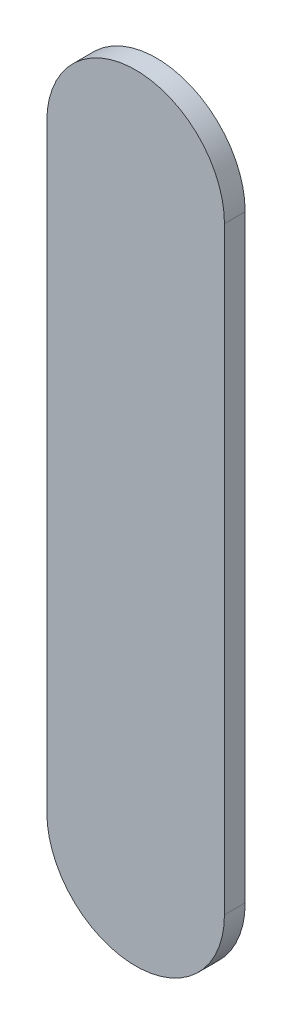
ISO-10303-21;
HEADER;
FILE_DESCRIPTION(('STEP AP214'),'2;1');
FILE_NAME('part.step','',(''),(''),'','','');
FILE_SCHEMA(('AUTOMOTIVE_DESIGN { 1 0 10303 214 1 1 1 1 }'));
ENDSEC;
DATA;
#1=APPLICATION_CONTEXT('core data for automotive mechanical design processes');
#2=APPLICATION_PROTOCOL_DEFINITION('international standard','automotive_design',2000,#1);
#3=PRODUCT_CONTEXT('',#1,'mechanical');
#4=PRODUCT('Part','Part','',(#3));
#5=PRODUCT_RELATED_PRODUCT_CATEGORY('part','',(#4));
#6=PRODUCT_DEFINITION_FORMATION('','',#4);
#7=PRODUCT_DEFINITION_CONTEXT('part definition',#1,'design');
#8=PRODUCT_DEFINITION('design','',#6,#7);
#9=PRODUCT_DEFINITION_SHAPE('','',#8);
#10=(LENGTH_UNIT() NAMED_UNIT(*) SI_UNIT(.MILLI.,.METRE.));
#11=(NAMED_UNIT(*) PLANE_ANGLE_UNIT() SI_UNIT($,.RADIAN.));
#12=(NAMED_UNIT(*) SI_UNIT($,.STERADIAN.) SOLID_ANGLE_UNIT());
#13=UNCERTAINTY_MEASURE_WITH_UNIT(LENGTH_MEASURE(1.E-05),#10,'distance_accuracy_value','');
#14=(GEOMETRIC_REPRESENTATION_CONTEXT(3) GLOBAL_UNCERTAINTY_ASSIGNED_CONTEXT((#13)) GLOBAL_UNIT_ASSIGNED_CONTEXT((#10,
#11,#12)) REPRESENTATION_CONTEXT('',''));
#15=CARTESIAN_POINT('',(0.,0.,0.));
#16=DIRECTION('',(0.,0.,1.));
#17=DIRECTION('',(1.,0.,0.));
#18=AXIS2_PLACEMENT_3D('',#15,#16,#17);
#19=CARTESIAN_POINT('',(132.19,-120.6,1.635));
#20=DIRECTION('',(0.,0.,1.));
#21=DIRECTION('',(1.,0.,0.));
#22=AXIS2_PLACEMENT_3D('',#19,#20,#21);
#23=PLANE('',#22);
#24=DIRECTION('',(0.,1.,0.));
#25=VECTOR('',#24,1.);
#26=CARTESIAN_POINT('',(132.19,-120.6,1.635));
#27=LINE('',#26,#25);
#28=CARTESIAN_POINT('',(132.19,-120.6,1.635));
#29=VERTEX_POINT('',#28);
#30=CARTESIAN_POINT('',(132.19,-119.589045,1.635));
#31=VERTEX_POINT('',#30);
#32=EDGE_CURVE('E70',#29,#31,#27,.T.);
#33=ORIENTED_EDGE('',*,*,#32,.T.);
#34=CARTESIAN_POINT('',(132.04,-119.589045,1.635));
#35=DIRECTION('',(0.,0.,1.));
#36=DIRECTION('',(1.,0.,0.));
#37=AXIS2_PLACEMENT_3D('',#34,#35,#36);
#38=CIRCLE('',#37,0.15);
#39=CARTESIAN_POINT('',(131.89,-119.589045,1.635));
#40=VERTEX_POINT('',#39);
#41=EDGE_CURVE('E68',#31,#40,#38,.T.);
#42=ORIENTED_EDGE('',*,*,#41,.T.);
#43=DIRECTION('',(0.,-1.,0.));
#44=VECTOR('',#43,1.);
#45=CARTESIAN_POINT('',(131.89,-119.589045,1.635));
#46=LINE('',#45,#44);
#47=CARTESIAN_POINT('',(131.89,-120.6,1.635));
#48=VERTEX_POINT('',#47);
#49=EDGE_CURVE('E56',#40,#48,#46,.T.);
#50=ORIENTED_EDGE('',*,*,#49,.T.);
#51=CARTESIAN_POINT('',(132.04,-120.6,1.635));
#52=DIRECTION('',(0.,0.,1.));
#53=DIRECTION('',(-1.,0.,0.));
#54=AXIS2_PLACEMENT_3D('',#51,#52,#53);
#55=CIRCLE('',#54,0.15);
#56=EDGE_CURVE('E11',#48,#29,#55,.T.);
#57=ORIENTED_EDGE('',*,*,#56,.T.);
#58=EDGE_LOOP('',(#33,#42,#50,#57));
#59=FACE_BOUND('',#58,.T.);
#60=ADVANCED_FACE('F17',(#59),#23,.T.);
#61=CARTESIAN_POINT('',(132.19,-120.6,1.6));
#62=DIRECTION('',(0.,0.,1.));
#63=DIRECTION('',(1.,0.,0.));
#64=AXIS2_PLACEMENT_3D('',#61,#62,#63);
#65=PLANE('',#64);
#66=CARTESIAN_POINT('',(132.04,-120.6,1.6));
#67=DIRECTION('',(0.,0.,1.));
#68=DIRECTION('',(-1.,0.,0.));
#69=AXIS2_PLACEMENT_3D('',#66,#67,#68);
#70=CIRCLE('',#69,0.15);
#71=CARTESIAN_POINT('',(131.89,-120.6,1.6));
#72=VERTEX_POINT('',#71);
#73=CARTESIAN_POINT('',(132.19,-120.6,1.6));
#74=VERTEX_POINT('',#73);
#75=EDGE_CURVE('E26',#72,#74,#70,.T.);
#76=ORIENTED_EDGE('',*,*,#75,.F.);
#77=DIRECTION('',(0.,-1.,0.));
#78=VECTOR('',#77,1.);
#79=CARTESIAN_POINT('',(131.89,-119.589045,1.6));
#80=LINE('',#79,#78);
#81=CARTESIAN_POINT('',(131.89,-119.589045,1.6));
#82=VERTEX_POINT('',#81);
#83=EDGE_CURVE('E75',#82,#72,#80,.T.);
#84=ORIENTED_EDGE('',*,*,#83,.F.);
#85=CARTESIAN_POINT('',(132.04,-119.589045,1.6));
#86=DIRECTION('',(0.,0.,1.));
#87=DIRECTION('',(1.,0.,0.));
#88=AXIS2_PLACEMENT_3D('',#85,#86,#87);
#89=CIRCLE('',#88,0.15);
#90=CARTESIAN_POINT('',(132.19,-119.589045,1.6));
#91=VERTEX_POINT('',#90);
#92=EDGE_CURVE('E79',#91,#82,#89,.T.);
#93=ORIENTED_EDGE('',*,*,#92,.F.);
#94=DIRECTION('',(0.,1.,0.));
#95=VECTOR('',#94,1.);
#96=CARTESIAN_POINT('',(132.19,-120.6,1.6));
#97=LINE('',#96,#95);
#98=EDGE_CURVE('E108',#74,#91,#97,.T.);
#99=ORIENTED_EDGE('',*,*,#98,.F.);
#100=EDGE_LOOP('',(#76,#84,#93,#99));
#101=FACE_BOUND('',#100,.T.);
#102=ADVANCED_FACE('F111',(#101),#65,.F.);
#103=CARTESIAN_POINT('',(132.04,-120.6,1.6));
#104=DIRECTION('',(0.,0.,-1.));
#105=DIRECTION('',(-1.,0.,0.));
#106=AXIS2_PLACEMENT_3D('',#103,#104,#105);
#107=CYLINDRICAL_SURFACE('',#106,0.15);
#108=ORIENTED_EDGE('',*,*,#75,.T.);
#109=DIRECTION('',(0.,0.,1.));
#110=VECTOR('',#109,1.);
#111=CARTESIAN_POINT('',(132.19,-120.6,1.6));
#112=LINE('',#111,#110);
#113=EDGE_CURVE('E86',#74,#29,#112,.T.);
#114=ORIENTED_EDGE('',*,*,#113,.T.);
#115=ORIENTED_EDGE('',*,*,#56,.F.);
#116=DIRECTION('',(0.,0.,1.));
#117=VECTOR('',#116,1.);
#118=CARTESIAN_POINT('',(131.89,-120.6,1.6));
#119=LINE('',#118,#117);
#120=EDGE_CURVE('E63',#72,#48,#119,.T.);
#121=ORIENTED_EDGE('',*,*,#120,.F.);
#122=EDGE_LOOP('',(#108,#114,#115,#121));
#123=FACE_BOUND('',#122,.T.);
#124=ADVANCED_FACE('F99',(#123),#107,.T.);
#125=CARTESIAN_POINT('',(131.89,-119.589045,1.6));
#126=DIRECTION('',(1.,0.,0.));
#127=DIRECTION('',(0.,1.,0.));
#128=AXIS2_PLACEMENT_3D('',#125,#126,#127);
#129=PLANE('',#128);
#130=ORIENTED_EDGE('',*,*,#83,.T.);
#131=ORIENTED_EDGE('',*,*,#120,.T.);
#132=ORIENTED_EDGE('',*,*,#49,.F.);
#133=DIRECTION('',(0.,0.,1.));
#134=VECTOR('',#133,1.);
#135=CARTESIAN_POINT('',(131.89,-119.589045,1.6));
#136=LINE('',#135,#134);
#137=EDGE_CURVE('E61',#82,#40,#136,.T.);
#138=ORIENTED_EDGE('',*,*,#137,.F.);
#139=EDGE_LOOP('',(#130,#131,#132,#138));
#140=FACE_BOUND('',#139,.T.);
#141=ADVANCED_FACE('F59',(#140),#129,.F.);
#142=CARTESIAN_POINT('',(132.04,-119.589045,1.6));
#143=DIRECTION('',(0.,0.,-1.));
#144=DIRECTION('',(1.,0.,0.));
#145=AXIS2_PLACEMENT_3D('',#142,#143,#144);
#146=CYLINDRICAL_SURFACE('',#145,0.15);
#147=ORIENTED_EDGE('',*,*,#92,.T.);
#148=ORIENTED_EDGE('',*,*,#137,.T.);
#149=ORIENTED_EDGE('',*,*,#41,.F.);
#150=DIRECTION('',(0.,0.,1.));
#151=VECTOR('',#150,1.);
#152=CARTESIAN_POINT('',(132.19,-119.589045,1.6));
#153=LINE('',#152,#151);
#154=EDGE_CURVE('E113',#91,#31,#153,.T.);
#155=ORIENTED_EDGE('',*,*,#154,.F.);
#156=EDGE_LOOP('',(#147,#148,#149,#155));
#157=FACE_BOUND('',#156,.T.);
#158=ADVANCED_FACE('F77',(#157),#146,.T.);
#159=CARTESIAN_POINT('',(132.19,-120.6,1.6));
#160=DIRECTION('',(-1.,0.,0.));
#161=DIRECTION('',(0.,0.,1.));
#162=AXIS2_PLACEMENT_3D('',#159,#160,#161);
#163=PLANE('',#162);
#164=ORIENTED_EDGE('',*,*,#98,.T.);
#165=ORIENTED_EDGE('',*,*,#154,.T.);
#166=ORIENTED_EDGE('',*,*,#32,.F.);
#167=ORIENTED_EDGE('',*,*,#113,.F.);
#168=EDGE_LOOP('',(#164,#165,#166,#167));
#169=FACE_BOUND('',#168,.T.);
#170=ADVANCED_FACE('F107',(#169),#163,.F.);
#171=CLOSED_SHELL('',(#60,#102,#124,#141,#158,#170));
#172=MANIFOLD_SOLID_BREP('B1',#171);
#173=ADVANCED_BREP_SHAPE_REPRESENTATION('',(#18,#172),#14);
#174=SHAPE_DEFINITION_REPRESENTATION(#9,#173);
ENDSEC;
END-ISO-10303-21;
